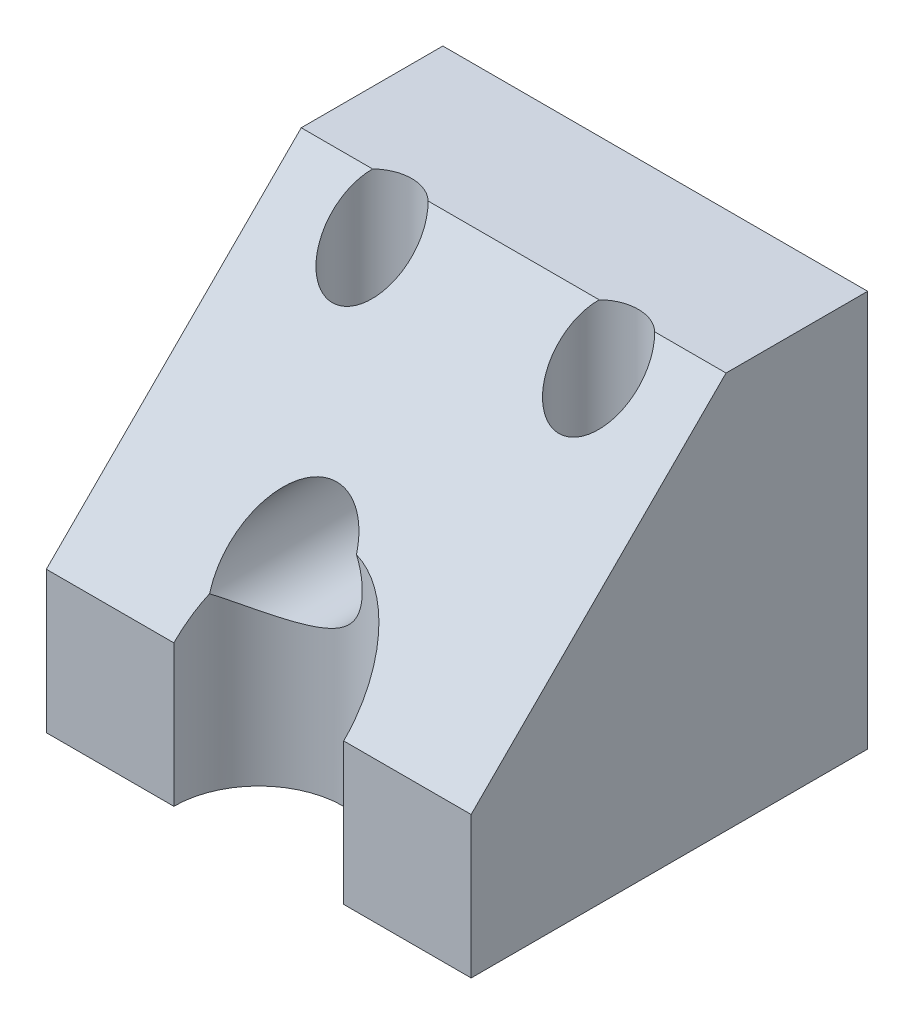
ISO-10303-21;
HEADER;
FILE_DESCRIPTION(('STEP AP214'),'2;1');
FILE_NAME('part.step','',(''),(''),'','','');
FILE_SCHEMA(('AUTOMOTIVE_DESIGN { 1 0 10303 214 1 1 1 1 }'));
ENDSEC;
DATA;
#1=APPLICATION_CONTEXT('core data for automotive mechanical design processes');
#2=APPLICATION_PROTOCOL_DEFINITION('international standard','automotive_design',2000,#1);
#3=PRODUCT_CONTEXT('',#1,'mechanical');
#4=PRODUCT('Part','Part','',(#3));
#5=PRODUCT_RELATED_PRODUCT_CATEGORY('part','',(#4));
#6=PRODUCT_DEFINITION_FORMATION('','',#4);
#7=PRODUCT_DEFINITION_CONTEXT('part definition',#1,'design');
#8=PRODUCT_DEFINITION('design','',#6,#7);
#9=PRODUCT_DEFINITION_SHAPE('','',#8);
#10=(LENGTH_UNIT() NAMED_UNIT(*) SI_UNIT(.MILLI.,.METRE.));
#11=(NAMED_UNIT(*) PLANE_ANGLE_UNIT() SI_UNIT($,.RADIAN.));
#12=(NAMED_UNIT(*) SI_UNIT($,.STERADIAN.) SOLID_ANGLE_UNIT());
#13=UNCERTAINTY_MEASURE_WITH_UNIT(LENGTH_MEASURE(1.E-05),#10,'distance_accuracy_value','');
#14=(GEOMETRIC_REPRESENTATION_CONTEXT(3) GLOBAL_UNCERTAINTY_ASSIGNED_CONTEXT((#13)) GLOBAL_UNIT_ASSIGNED_CONTEXT((#10,
#11,#12)) REPRESENTATION_CONTEXT('',''));
#15=CARTESIAN_POINT('',(0.,0.,0.));
#16=DIRECTION('',(0.,0.,1.));
#17=DIRECTION('',(1.,0.,0.));
#18=AXIS2_PLACEMENT_3D('',#15,#16,#17);
#19=CARTESIAN_POINT('',(15.,5.,14.));
#20=DIRECTION('',(0.,0.,-1.));
#21=DIRECTION('',(-1.,0.,0.));
#22=AXIS2_PLACEMENT_3D('',#19,#20,#21);
#23=PLANE('',#22);
#24=DIRECTION('',(-1.,0.,0.));
#25=VECTOR('',#24,1.);
#26=CARTESIAN_POINT('',(15.,5.,14.));
#27=LINE('',#26,#25);
#28=CARTESIAN_POINT('',(15.,5.,14.));
#29=VERTEX_POINT('',#28);
#30=CARTESIAN_POINT('',(10.5,5.,14.));
#31=VERTEX_POINT('',#30);
#32=EDGE_CURVE('E169',#29,#31,#27,.T.);
#33=ORIENTED_EDGE('',*,*,#32,.T.);
#34=DIRECTION('',(0.,-1.,0.));
#35=VECTOR('',#34,1.);
#36=CARTESIAN_POINT('',(10.5,14.,14.));
#37=LINE('',#36,#35);
#38=CARTESIAN_POINT('',(10.5,0.,14.));
#39=VERTEX_POINT('',#38);
#40=EDGE_CURVE('E217',#31,#39,#37,.T.);
#41=ORIENTED_EDGE('',*,*,#40,.T.);
#42=DIRECTION('',(-1.,0.,0.));
#43=VECTOR('',#42,1.);
#44=CARTESIAN_POINT('',(15.,0.,14.));
#45=LINE('',#44,#43);
#46=CARTESIAN_POINT('',(15.,0.,14.));
#47=VERTEX_POINT('',#46);
#48=EDGE_CURVE('E184',#47,#39,#45,.T.);
#49=ORIENTED_EDGE('',*,*,#48,.F.);
#50=DIRECTION('',(0.,-1.,0.));
#51=VECTOR('',#50,1.);
#52=CARTESIAN_POINT('',(15.,5.,14.));
#53=LINE('',#52,#51);
#54=EDGE_CURVE('E147',#29,#47,#53,.T.);
#55=ORIENTED_EDGE('',*,*,#54,.F.);
#56=EDGE_LOOP('',(#33,#41,#49,#55));
#57=FACE_BOUND('',#56,.T.);
#58=ADVANCED_FACE('F35',(#57),#23,.F.);
#59=CARTESIAN_POINT('',(4.5,0.,14.));
#60=VERTEX_POINT('',#59);
#61=CARTESIAN_POINT('',(0.,0.,14.));
#62=VERTEX_POINT('',#61);
#63=EDGE_CURVE('E183',#60,#62,#45,.T.);
#64=ORIENTED_EDGE('',*,*,#63,.F.);
#65=DIRECTION('',(0.,-1.,0.));
#66=VECTOR('',#65,1.);
#67=CARTESIAN_POINT('',(4.5,14.,14.));
#68=LINE('',#67,#66);
#69=CARTESIAN_POINT('',(4.5,5.,14.));
#70=VERTEX_POINT('',#69);
#71=EDGE_CURVE('E126',#60,#70,#68,.F.);
#72=ORIENTED_EDGE('',*,*,#71,.T.);
#73=CARTESIAN_POINT('',(0.,5.,14.));
#74=VERTEX_POINT('',#73);
#75=EDGE_CURVE('E125',#70,#74,#27,.T.);
#76=ORIENTED_EDGE('',*,*,#75,.T.);
#77=DIRECTION('',(0.,-1.,0.));
#78=VECTOR('',#77,1.);
#79=CARTESIAN_POINT('',(0.,5.,14.));
#80=LINE('',#79,#78);
#81=EDGE_CURVE('E146',#74,#62,#80,.T.);
#82=ORIENTED_EDGE('',*,*,#81,.T.);
#83=EDGE_LOOP('',(#64,#72,#76,#82));
#84=FACE_BOUND('',#83,.T.);
#85=ADVANCED_FACE('F37',(#84),#23,.F.);
#86=CARTESIAN_POINT('',(15.,0.,14.));
#87=DIRECTION('',(0.,1.,0.));
#88=DIRECTION('',(0.,0.,1.));
#89=AXIS2_PLACEMENT_3D('',#86,#87,#88);
#90=PLANE('',#89);
#91=CARTESIAN_POINT('',(3.5,0.,6.));
#92=DIRECTION('',(0.,1.,0.));
#93=DIRECTION('',(0.,0.,1.));
#94=AXIS2_PLACEMENT_3D('',#91,#92,#93);
#95=CIRCLE('',#94,1.4);
#96=CARTESIAN_POINT('',(3.5,0.,7.4));
#97=VERTEX_POINT('',#96);
#98=EDGE_CURVE('E131',#97,#97,#95,.T.);
#99=ORIENTED_EDGE('',*,*,#98,.T.);
#100=EDGE_LOOP('',(#99));
#101=FACE_BOUND('',#100,.T.);
#102=CARTESIAN_POINT('',(11.5,0.,6.));
#103=DIRECTION('',(0.,1.,0.));
#104=DIRECTION('',(0.,0.,1.));
#105=AXIS2_PLACEMENT_3D('',#102,#103,#104);
#106=CIRCLE('',#105,1.4);
#107=CARTESIAN_POINT('',(11.5,0.,7.4));
#108=VERTEX_POINT('',#107);
#109=EDGE_CURVE('E143',#108,#108,#106,.T.);
#110=ORIENTED_EDGE('',*,*,#109,.T.);
#111=EDGE_LOOP('',(#110));
#112=FACE_BOUND('',#111,.T.);
#113=ORIENTED_EDGE('',*,*,#48,.T.);
#114=CARTESIAN_POINT('',(7.5,0.,14.));
#115=DIRECTION('',(0.,1.,0.));
#116=DIRECTION('',(0.,0.,1.));
#117=AXIS2_PLACEMENT_3D('',#114,#115,#116);
#118=CIRCLE('',#117,3.);
#119=EDGE_CURVE('E221',#39,#60,#118,.T.);
#120=ORIENTED_EDGE('',*,*,#119,.T.);
#121=ORIENTED_EDGE('',*,*,#63,.T.);
#122=DIRECTION('',(0.,0.,-1.));
#123=VECTOR('',#122,1.);
#124=CARTESIAN_POINT('',(0.,0.,14.));
#125=LINE('',#124,#123);
#126=CARTESIAN_POINT('',(0.,0.,0.));
#127=VERTEX_POINT('',#126);
#128=EDGE_CURVE('E161',#62,#127,#125,.T.);
#129=ORIENTED_EDGE('',*,*,#128,.T.);
#130=DIRECTION('',(-1.,0.,0.));
#131=VECTOR('',#130,1.);
#132=CARTESIAN_POINT('',(15.,0.,0.));
#133=LINE('',#132,#131);
#134=CARTESIAN_POINT('',(15.,0.,0.));
#135=VERTEX_POINT('',#134);
#136=EDGE_CURVE('E180',#135,#127,#133,.T.);
#137=ORIENTED_EDGE('',*,*,#136,.F.);
#138=DIRECTION('',(0.,0.,-1.));
#139=VECTOR('',#138,1.);
#140=CARTESIAN_POINT('',(15.,0.,14.));
#141=LINE('',#140,#139);
#142=EDGE_CURVE('E150',#47,#135,#141,.T.);
#143=ORIENTED_EDGE('',*,*,#142,.F.);
#144=EDGE_LOOP('',(#113,#120,#121,#129,#137,#143));
#145=FACE_BOUND('',#144,.T.);
#146=ADVANCED_FACE('F211',(#101,#112,#145),#90,.F.);
#147=CARTESIAN_POINT('',(15.,0.,0.));
#148=DIRECTION('',(0.,0.,1.));
#149=DIRECTION('',(1.,0.,0.));
#150=AXIS2_PLACEMENT_3D('',#147,#148,#149);
#151=PLANE('',#150);
#152=CARTESIAN_POINT('',(6.35,7.,0.));
#153=DIRECTION('',(0.,0.,-1.));
#154=DIRECTION('',(-1.,0.,0.));
#155=AXIS2_PLACEMENT_3D('',#152,#153,#154);
#156=CIRCLE('',#155,1.9);
#157=CARTESIAN_POINT('',(4.45,7.,0.));
#158=VERTEX_POINT('',#157);
#159=EDGE_CURVE('E134',#158,#158,#156,.T.);
#160=ORIENTED_EDGE('',*,*,#159,.F.);
#161=EDGE_LOOP('',(#160));
#162=FACE_BOUND('',#161,.T.);
#163=DIRECTION('',(0.,1.,0.));
#164=VECTOR('',#163,1.);
#165=CARTESIAN_POINT('',(0.,0.,0.));
#166=LINE('',#165,#164);
#167=CARTESIAN_POINT('',(0.,14.,0.));
#168=VERTEX_POINT('',#167);
#169=EDGE_CURVE('E163',#127,#168,#166,.T.);
#170=ORIENTED_EDGE('',*,*,#169,.T.);
#171=DIRECTION('',(-1.,0.,0.));
#172=VECTOR('',#171,1.);
#173=CARTESIAN_POINT('',(15.,14.,0.));
#174=LINE('',#173,#172);
#175=CARTESIAN_POINT('',(15.,14.,0.));
#176=VERTEX_POINT('',#175);
#177=EDGE_CURVE('E176',#176,#168,#174,.T.);
#178=ORIENTED_EDGE('',*,*,#177,.F.);
#179=DIRECTION('',(0.,1.,0.));
#180=VECTOR('',#179,1.);
#181=CARTESIAN_POINT('',(15.,0.,0.));
#182=LINE('',#181,#180);
#183=EDGE_CURVE('E153',#135,#176,#182,.T.);
#184=ORIENTED_EDGE('',*,*,#183,.F.);
#185=ORIENTED_EDGE('',*,*,#136,.T.);
#186=EDGE_LOOP('',(#170,#178,#184,#185));
#187=FACE_BOUND('',#186,.T.);
#188=ADVANCED_FACE('F229',(#162,#187),#151,.F.);
#189=CARTESIAN_POINT('',(15.,14.,0.));
#190=DIRECTION('',(0.,-1.,0.));
#191=DIRECTION('',(0.,0.,-1.));
#192=AXIS2_PLACEMENT_3D('',#189,#190,#191);
#193=PLANE('',#192);
#194=DIRECTION('',(-1.,0.,0.));
#195=VECTOR('',#194,1.);
#196=CARTESIAN_POINT('',(15.,14.,5.00000000000004));
#197=LINE('',#196,#195);
#198=CARTESIAN_POINT('',(2.52020410288669,14.,5.00000000000004));
#199=VERTEX_POINT('',#198);
#200=CARTESIAN_POINT('',(0.,14.,5.00000000000004));
#201=VERTEX_POINT('',#200);
#202=EDGE_CURVE('E172',#199,#201,#197,.T.);
#203=ORIENTED_EDGE('',*,*,#202,.F.);
#204=CARTESIAN_POINT('',(3.5,14.,6.));
#205=DIRECTION('',(0.,-1.,0.));
#206=DIRECTION('',(0.,0.,-1.));
#207=AXIS2_PLACEMENT_3D('',#204,#205,#206);
#208=CIRCLE('',#207,1.4);
#209=CARTESIAN_POINT('',(4.47979589711331,14.,5.00000000000004));
#210=VERTEX_POINT('',#209);
#211=EDGE_CURVE('E61',#199,#210,#208,.T.);
#212=ORIENTED_EDGE('',*,*,#211,.T.);
#213=CARTESIAN_POINT('',(10.5202041028867,14.,5.00000000000004));
#214=VERTEX_POINT('',#213);
#215=EDGE_CURVE('E177',#214,#210,#197,.T.);
#216=ORIENTED_EDGE('',*,*,#215,.F.);
#217=CARTESIAN_POINT('',(11.5,14.,6.));
#218=DIRECTION('',(0.,-1.,0.));
#219=DIRECTION('',(0.,0.,-1.));
#220=AXIS2_PLACEMENT_3D('',#217,#218,#219);
#221=CIRCLE('',#220,1.4);
#222=CARTESIAN_POINT('',(12.4797958971133,14.,5.00000000000004));
#223=VERTEX_POINT('',#222);
#224=EDGE_CURVE('E140',#214,#223,#221,.T.);
#225=ORIENTED_EDGE('',*,*,#224,.T.);
#226=CARTESIAN_POINT('',(15.,14.,5.00000000000004));
#227=VERTEX_POINT('',#226);
#228=EDGE_CURVE('E173',#227,#223,#197,.T.);
#229=ORIENTED_EDGE('',*,*,#228,.F.);
#230=DIRECTION('',(0.,0.,1.));
#231=VECTOR('',#230,1.);
#232=CARTESIAN_POINT('',(15.,14.,0.));
#233=LINE('',#232,#231);
#234=EDGE_CURVE('E155',#176,#227,#233,.T.);
#235=ORIENTED_EDGE('',*,*,#234,.F.);
#236=ORIENTED_EDGE('',*,*,#177,.T.);
#237=DIRECTION('',(0.,0.,1.));
#238=VECTOR('',#237,1.);
#239=CARTESIAN_POINT('',(0.,14.,0.));
#240=LINE('',#239,#238);
#241=EDGE_CURVE('E165',#168,#201,#240,.T.);
#242=ORIENTED_EDGE('',*,*,#241,.T.);
#243=EDGE_LOOP('',(#203,#212,#216,#225,#229,#235,#236,#242));
#244=FACE_BOUND('',#243,.T.);
#245=ADVANCED_FACE('F232',(#244),#193,.F.);
#246=CARTESIAN_POINT('',(15.,14.,5.00000000000004));
#247=DIRECTION('',(0.,-0.707106781186546,-0.707106781186549));
#248=DIRECTION('',(0.,0.707106781186549,-0.707106781186546));
#249=AXIS2_PLACEMENT_3D('',#246,#247,#248);
#250=PLANE('',#249);
#251=ORIENTED_EDGE('',*,*,#75,.F.);
#252=CARTESIAN_POINT('',(7.5,5.,14.));
#253=DIRECTION('',(0.,-0.707106781186546,-0.707106781186549));
#254=DIRECTION('',(0.,-0.707106781186549,0.707106781186546));
#255=AXIS2_PLACEMENT_3D('',#252,#253,#254);
#256=ELLIPSE('',#255,4.24264068711929,3.);
#257=CARTESIAN_POINT('',(4.69563469152131,6.06561494762474,12.9343850523753));
#258=VERTEX_POINT('',#257);
#259=EDGE_CURVE('E115',#70,#258,#256,.T.);
#260=ORIENTED_EDGE('',*,*,#259,.T.);
#261=CARTESIAN_POINT('',(6.35,7.,12.));
#262=DIRECTION('',(0.,-0.707106781186546,-0.707106781186549));
#263=DIRECTION('',(0.,0.707106781186549,-0.707106781186546));
#264=AXIS2_PLACEMENT_3D('',#261,#262,#263);
#265=ELLIPSE('',#264,2.68700576850887,1.9);
#266=CARTESIAN_POINT('',(7.98978099659515,7.95974907304223,11.0402509269578));
#267=VERTEX_POINT('',#266);
#268=EDGE_CURVE('E123',#258,#267,#265,.T.);
#269=ORIENTED_EDGE('',*,*,#268,.T.);
#270=EDGE_CURVE('E55',#267,#31,#256,.T.);
#271=ORIENTED_EDGE('',*,*,#270,.T.);
#272=ORIENTED_EDGE('',*,*,#32,.F.);
#273=DIRECTION('',(0.,-0.707106781186549,0.707106781186546));
#274=VECTOR('',#273,1.);
#275=CARTESIAN_POINT('',(15.,14.,5.00000000000004));
#276=LINE('',#275,#274);
#277=EDGE_CURVE('E157',#227,#29,#276,.T.);
#278=ORIENTED_EDGE('',*,*,#277,.F.);
#279=ORIENTED_EDGE('',*,*,#228,.T.);
#280=CARTESIAN_POINT('',(11.5,13.,6.));
#281=DIRECTION('',(0.,-0.707106781186546,-0.707106781186549));
#282=DIRECTION('',(0.,-0.707106781186549,0.707106781186546));
#283=AXIS2_PLACEMENT_3D('',#280,#281,#282);
#284=ELLIPSE('',#283,1.97989898732234,1.4);
#285=EDGE_CURVE('E187',#223,#214,#284,.T.);
#286=ORIENTED_EDGE('',*,*,#285,.T.);
#287=ORIENTED_EDGE('',*,*,#215,.T.);
#288=CARTESIAN_POINT('',(3.5,13.,6.));
#289=DIRECTION('',(0.,-0.707106781186546,-0.707106781186549));
#290=DIRECTION('',(0.,-0.707106781186549,0.707106781186546));
#291=AXIS2_PLACEMENT_3D('',#288,#289,#290);
#292=ELLIPSE('',#291,1.97989898732234,1.4);
#293=EDGE_CURVE('E48',#210,#199,#292,.T.);
#294=ORIENTED_EDGE('',*,*,#293,.T.);
#295=ORIENTED_EDGE('',*,*,#202,.T.);
#296=DIRECTION('',(0.,-0.707106781186549,0.707106781186546));
#297=VECTOR('',#296,1.);
#298=CARTESIAN_POINT('',(0.,14.,5.00000000000004));
#299=LINE('',#298,#297);
#300=EDGE_CURVE('E151',#201,#74,#299,.T.);
#301=ORIENTED_EDGE('',*,*,#300,.T.);
#302=EDGE_LOOP('',(#251,#260,#269,#271,#272,#278,#279,#286,#287,#294,#295,#301));
#303=FACE_BOUND('',#302,.T.);
#304=ADVANCED_FACE('F122',(#303),#250,.F.);
#305=CARTESIAN_POINT('',(15.,0.,0.));
#306=DIRECTION('',(1.,0.,0.));
#307=DIRECTION('',(0.,0.,-1.));
#308=AXIS2_PLACEMENT_3D('',#305,#306,#307);
#309=PLANE('',#308);
#310=ORIENTED_EDGE('',*,*,#54,.T.);
#311=ORIENTED_EDGE('',*,*,#142,.T.);
#312=ORIENTED_EDGE('',*,*,#183,.T.);
#313=ORIENTED_EDGE('',*,*,#234,.T.);
#314=ORIENTED_EDGE('',*,*,#277,.T.);
#315=EDGE_LOOP('',(#310,#311,#312,#313,#314));
#316=FACE_BOUND('',#315,.T.);
#317=ADVANCED_FACE('F259',(#316),#309,.T.);
#318=CARTESIAN_POINT('',(0.,0.,0.));
#319=DIRECTION('',(1.,0.,0.));
#320=DIRECTION('',(0.,0.,-1.));
#321=AXIS2_PLACEMENT_3D('',#318,#319,#320);
#322=PLANE('',#321);
#323=ORIENTED_EDGE('',*,*,#81,.F.);
#324=ORIENTED_EDGE('',*,*,#300,.F.);
#325=ORIENTED_EDGE('',*,*,#241,.F.);
#326=ORIENTED_EDGE('',*,*,#169,.F.);
#327=ORIENTED_EDGE('',*,*,#128,.F.);
#328=EDGE_LOOP('',(#323,#324,#325,#326,#327));
#329=FACE_BOUND('',#328,.T.);
#330=ADVANCED_FACE('F247',(#329),#322,.F.);
#331=CARTESIAN_POINT('',(11.5,14.,6.));
#332=DIRECTION('',(0.,-1.,0.));
#333=DIRECTION('',(0.,0.,-1.));
#334=AXIS2_PLACEMENT_3D('',#331,#332,#333);
#335=CYLINDRICAL_SURFACE('',#334,1.4);
#336=ORIENTED_EDGE('',*,*,#224,.F.);
#337=ORIENTED_EDGE('',*,*,#285,.F.);
#338=EDGE_LOOP('',(#336,#337));
#339=FACE_BOUND('',#338,.T.);
#340=ORIENTED_EDGE('',*,*,#109,.F.);
#341=EDGE_LOOP('',(#340));
#342=FACE_BOUND('',#341,.T.);
#343=ADVANCED_FACE('F251',(#339,#342),#335,.F.);
#344=CARTESIAN_POINT('',(3.5,14.,6.));
#345=DIRECTION('',(0.,-1.,0.));
#346=DIRECTION('',(0.,0.,-1.));
#347=AXIS2_PLACEMENT_3D('',#344,#345,#346);
#348=CYLINDRICAL_SURFACE('',#347,1.4);
#349=CARTESIAN_POINT('',(4.45,7.,7.02834819006016));
#350=CARTESIAN_POINT('',(4.45000064995976,6.92609286150742,7.0283480283778));
#351=CARTESIAN_POINT('',(4.45433351958509,6.85218305321146,7.02439538414719));
#352=CARTESIAN_POINT('',(4.47141138318347,6.70623064714899,7.00821539252774));
#353=CARTESIAN_POINT('',(4.48415767027153,6.63418833818028,6.99598677314103));
#354=CARTESIAN_POINT('',(4.51727194159195,6.49370090207656,6.96214487221569));
#355=CARTESIAN_POINT('',(4.537679830412,6.42527678659842,6.94048235909895));
#356=CARTESIAN_POINT('',(4.58428473873445,6.29501131971183,6.88633629637029));
#357=CARTESIAN_POINT('',(4.61047167480387,6.23315877715606,6.85387154529549));
#358=CARTESIAN_POINT('',(4.65892439084027,6.13246793942749,6.78624271031036));
#359=CARTESIAN_POINT('',(4.68062625464207,6.09166633371794,6.753589300313));
#360=CARTESIAN_POINT('',(4.72374189031642,6.01655918487933,6.68133712244338));
#361=CARTESIAN_POINT('',(4.74515582422065,5.98224983281024,6.64174245337276));
#362=CARTESIAN_POINT('',(4.78575063416761,5.92088436065188,6.55596890607038));
#363=CARTESIAN_POINT('',(4.80492188218498,5.89385890745924,6.50976340596175));
#364=CARTESIAN_POINT('',(4.83897781561658,5.84776757546238,6.41207952433485));
#365=CARTESIAN_POINT('',(4.85386258655594,5.82870153784605,6.36060124804841));
#366=CARTESIAN_POINT('',(4.87691819989038,5.79985602826036,6.25815008476682));
#367=CARTESIAN_POINT('',(4.88551617276316,5.78947681683498,6.20744083801468));
#368=CARTESIAN_POINT('',(4.89705780956946,5.77564630089286,6.10445984095688));
#369=CARTESIAN_POINT('',(4.90000241222446,5.77219384620916,6.05218835152004));
#370=CARTESIAN_POINT('',(4.89999764298233,5.77220024740515,5.94894543502815));
#371=CARTESIAN_POINT('',(4.89719223228371,5.77549029325675,5.8979738261617));
#372=CARTESIAN_POINT('',(4.8861972682631,5.7886560168048,5.7974890029382));
#373=CARTESIAN_POINT('',(4.87800845038451,5.79853079494386,5.74797559033778));
#374=CARTESIAN_POINT('',(4.85690691534817,5.82485962098794,5.6518261568488));
#375=CARTESIAN_POINT('',(4.84399726756242,5.84130939463136,5.60518828932144));
#376=CARTESIAN_POINT('',(4.81451334901581,5.88067780229595,5.51599358309867));
#377=CARTESIAN_POINT('',(4.79793931468207,5.90359601899793,5.47343648136509));
#378=CARTESIAN_POINT('',(4.76216717351014,5.95606080501808,5.39260783230651));
#379=CARTESIAN_POINT('',(4.74292635641893,5.98572168777648,5.35442965956175));
#380=CARTESIAN_POINT('',(4.70364748042908,6.05080735248944,5.28385213463434));
#381=CARTESIAN_POINT('',(4.68360921738074,6.08623361767234,5.25145427402904));
#382=CARTESIAN_POINT('',(4.64284034045792,6.16471918227356,5.19045738392367));
#383=CARTESIAN_POINT('',(4.62216216658762,6.20814254488874,5.16229366403411));
#384=CARTESIAN_POINT('',(4.5831466174929,6.29949915013994,5.1124199320163));
#385=CARTESIAN_POINT('',(4.56481048836009,6.3474347701721,5.0907133473309));
#386=CARTESIAN_POINT('',(4.5292834560693,6.45361003394533,5.05058176042498));
#387=CARTESIAN_POINT('',(4.5126089833088,6.51235432547135,5.03303672442054));
#388=CARTESIAN_POINT('',(4.48481091737809,6.63271841425338,5.00474164197536));
#389=CARTESIAN_POINT('',(4.47369068622309,6.69433992849533,4.99399571002527));
#390=CARTESIAN_POINT('',(4.45637329250652,6.82851242938649,4.97749313470097));
#391=CARTESIAN_POINT('',(4.45116582982534,6.90131540556864,4.97272769669764));
#392=CARTESIAN_POINT('',(4.44918329486831,7.04717499932989,4.9708985047513));
#393=CARTESIAN_POINT('',(4.4524151188537,7.12023177559501,4.97384104948217));
#394=CARTESIAN_POINT('',(4.46766523650853,7.26993930607977,4.98819606250099));
#395=CARTESIAN_POINT('',(4.48029479734975,7.34647391013808,5.00019865844252));
#396=CARTESIAN_POINT('',(4.51409460865593,7.49522091266385,5.03449960939569));
#397=CARTESIAN_POINT('',(4.53525502935904,7.56743817622509,5.05678611893197));
#398=CARTESIAN_POINT('',(4.57875750787282,7.68991298817058,5.10717970427288));
#399=CARTESIAN_POINT('',(4.59986477443471,7.74155133010828,5.13300127113054));
#400=CARTESIAN_POINT('',(4.64437760291101,7.83887243109401,5.19267015736367));
#401=CARTESIAN_POINT('',(4.66778138882748,7.88455972968328,5.22651130306869));
#402=CARTESIAN_POINT('',(4.71481471806554,7.96877013279968,5.30269442762766));
#403=CARTESIAN_POINT('',(4.73844473641724,8.00724439022692,5.34509059513542));
#404=CARTESIAN_POINT('',(4.78310888494862,8.07541703446047,5.43763074131631));
#405=CARTESIAN_POINT('',(4.80414415960836,8.1051192985038,5.48777128199222));
#406=CARTESIAN_POINT('',(4.83893379504213,8.15214439802476,5.5880094536838));
#407=CARTESIAN_POINT('',(4.85325208368114,8.17050906185026,5.63742566774936));
#408=CARTESIAN_POINT('',(4.8765702906528,8.19973246107825,5.73962184090564));
#409=CARTESIAN_POINT('',(4.88557141507345,8.21059289875313,5.79240103416308));
#410=CARTESIAN_POINT('',(4.89710542657529,8.22440729016771,5.89660316160271));
#411=CARTESIAN_POINT('',(4.89997363173768,8.2277715713313,5.94793542240388));
#412=CARTESIAN_POINT('',(4.90002598684731,8.22783381015203,6.05060293457127));
#413=CARTESIAN_POINT('',(4.89721102209464,8.22453280609903,6.10193818422624));
#414=CARTESIAN_POINT('',(4.8861688716616,8.21130938682654,6.20268708386456));
#415=CARTESIAN_POINT('',(4.877989262579,8.20144516675573,6.25211361826634));
#416=CARTESIAN_POINT('',(4.85691721945477,8.17515333508244,6.34812511303982));
#417=CARTESIAN_POINT('',(4.84402535542817,8.15872651729824,6.39471041630433));
#418=CARTESIAN_POINT('',(4.81448988603437,8.11929245558608,6.48409377787564));
#419=CARTESIAN_POINT('',(4.79782330009758,8.09624466214885,6.52686630262102));
#420=CARTESIAN_POINT('',(4.76217529782355,8.04394018837511,6.6073326125224));
#421=CARTESIAN_POINT('',(4.74319369399646,8.01468300500716,6.64502598580446));
#422=CARTESIAN_POINT('',(4.7036666095967,7.94926302770685,6.71617841882637));
#423=CARTESIAN_POINT('',(4.68308894437246,7.91287080594051,6.74940777295595));
#424=CARTESIAN_POINT('',(4.64270481649698,7.83490843057553,6.8096571375727));
#425=CARTESIAN_POINT('',(4.62289864668738,7.79333633547955,6.83667480896361));
#426=CARTESIAN_POINT('',(4.58339420878996,7.70133269522837,6.88735632382095));
#427=CARTESIAN_POINT('',(4.56393614989085,7.65042917192698,6.91034798559363));
#428=CARTESIAN_POINT('',(4.52894608409965,7.54485382248806,6.94971759276988));
#429=CARTESIAN_POINT('',(4.51341718615816,7.49017905561006,6.96609030701237));
#430=CARTESIAN_POINT('',(4.4839087395384,7.3644564246167,6.99623341025771));
#431=CARTESIAN_POINT('',(4.47125829739749,7.2926989222263,7.00836328434396));
#432=CARTESIAN_POINT('',(4.45430075256531,7.14729600066153,7.02442355678725));
#433=CARTESIAN_POINT('',(4.44999935230751,7.07364932593554,7.02834835117851));
#434=CARTESIAN_POINT('',(4.45,7.,7.02834819006016));
#435=B_SPLINE_CURVE_WITH_KNOTS('',3,(#349,#350,#351,#352,#353,#354,#355,#356,#357,#358,#359,
#360,#361,#362,#363,#364,#365,#366,#367,#368,#369,#370,#371,#372,#373,#374,#375,#376,#377,#378,
#379,#380,#381,#382,#383,#384,#385,#386,#387,#388,#389,#390,#391,#392,#393,#394,#395,#396,#397,
#398,#399,#400,#401,#402,#403,#404,#405,#406,#407,#408,#409,#410,#411,#412,#413,#414,#415,#416,
#417,#418,#419,#420,#421,#422,#423,#424,#425,#426,#427,#428,#429,#430,#431,#432,#433,#434),
.UNSPECIFIED.,.T.,.F.,(4,2,2,2,2,2,2,2,2,2,2,2,2,2,2,2,2,2,2,2,2,2,2,2,2,2,2,2,2,2,2,2,2,2,2,2,
2,2,2,2,2,2,4),(0.,0.221490034531486,0.443014119292837,0.665708365242151,0.888017078108974,
1.05705852724063,1.22600049185861,1.3956430073618,1.56528213787072,1.72191999076116,
1.87853183225765,2.03127055265376,2.18398841129008,2.33660715241643,2.48921604941571,
2.64463587706335,2.80009575210956,2.96663534122785,3.13326317235149,3.32313147959731,
3.51311457638937,3.7316189275394,3.95030188792532,4.18460902882451,4.41864695530529,
4.60230759620949,4.78582730728731,4.97054816295571,5.15518724905327,5.31822255883963,
5.48122087324598,5.63505173198879,5.78885862946204,5.94131959988107,6.09376213405211,
6.24715895296733,6.40056820352223,6.5601143249891,6.71972042774178,6.89647412029288,
7.07336723498918,7.29393404378885,7.51465144778253),.UNSPECIFIED.);
#436=CARTESIAN_POINT('',(4.45,7.,7.02834819006016));
#437=VERTEX_POINT('',#436);
#438=EDGE_CURVE('E129',#437,#437,#435,.T.);
#439=ORIENTED_EDGE('',*,*,#438,.T.);
#440=EDGE_LOOP('',(#439));
#441=FACE_BOUND('',#440,.T.);
#442=ORIENTED_EDGE('',*,*,#211,.F.);
#443=ORIENTED_EDGE('',*,*,#293,.F.);
#444=EDGE_LOOP('',(#442,#443));
#445=FACE_BOUND('',#444,.T.);
#446=ORIENTED_EDGE('',*,*,#98,.F.);
#447=EDGE_LOOP('',(#446));
#448=FACE_BOUND('',#447,.T.);
#449=ADVANCED_FACE('F193',(#441,#445,#448),#348,.F.);
#450=CARTESIAN_POINT('',(6.35,7.,14.));
#451=DIRECTION('',(0.,0.,-1.));
#452=DIRECTION('',(-1.,0.,0.));
#453=AXIS2_PLACEMENT_3D('',#450,#451,#452);
#454=CYLINDRICAL_SURFACE('',#453,1.9);
#455=ORIENTED_EDGE('',*,*,#438,.F.);
#456=EDGE_LOOP('',(#455));
#457=FACE_BOUND('',#456,.T.);
#458=ORIENTED_EDGE('',*,*,#159,.T.);
#459=EDGE_LOOP('',(#458));
#460=FACE_BOUND('',#459,.T.);
#461=ORIENTED_EDGE('',*,*,#268,.F.);
#462=CARTESIAN_POINT('',(4.50004592701822,6.56679112675511,13.9834));
#463=CARTESIAN_POINT('',(4.50032739318488,6.56571448715011,13.9301235412732));
#464=CARTESIAN_POINT('',(4.50204695274997,6.55817289952806,13.8777570163658));
#465=CARTESIAN_POINT('',(4.50794337550782,6.53417729167799,13.7761418180256));
#466=CARTESIAN_POINT('',(4.51207521169928,6.51788700782004,13.7268538738476));
#467=CARTESIAN_POINT('',(4.52423813732502,6.47343263303276,13.6137862387994));
#468=CARTESIAN_POINT('',(4.53313058930759,6.44310708453319,13.5510283500572));
#469=CARTESIAN_POINT('',(4.5543173795353,6.37813597667564,13.4283206807857));
#470=CARTESIAN_POINT('',(4.56661927559913,6.34348091479269,13.3683774889703));
#471=CARTESIAN_POINT('',(4.59477816788162,6.27149470248636,13.2493339842895));
#472=CARTESIAN_POINT('',(4.61069982744601,6.23412453873679,13.1902729182248));
#473=CARTESIAN_POINT('',(4.64592359822312,6.15865495430322,13.0737473759073));
#474=CARTESIAN_POINT('',(4.66522229439552,6.12055630464561,13.0162813540397));
#475=CARTESIAN_POINT('',(4.718265265554,6.02437995000515,12.8728419136865));
#476=CARTESIAN_POINT('',(4.75428115172063,5.96629044306482,12.7877034444881));
#477=CARTESIAN_POINT('',(4.83456397589973,5.85180319380198,12.6201154391962));
#478=CARTESIAN_POINT('',(4.87883671150522,5.79540667272152,12.5376678406033));
#479=CARTESIAN_POINT('',(4.97556391130926,5.68614846336567,12.3764274848186));
#480=CARTESIAN_POINT('',(5.02794978342751,5.63326201563209,12.2976106855737));
#481=CARTESIAN_POINT('',(5.14144506101817,5.53194741904198,12.1435617208288));
#482=CARTESIAN_POINT('',(5.20254743318626,5.48351572699012,12.068326729838));
#483=CARTESIAN_POINT('',(5.34755989560015,5.38307685249172,11.9068904313503));
#484=CARTESIAN_POINT('',(5.43356730526926,5.33244086055151,11.8216870957693));
#485=CARTESIAN_POINT('',(5.61896026984228,5.24325853523181,11.6597443816394));
#486=CARTESIAN_POINT('',(5.71833907451655,5.20470613422532,11.5830007677367));
#487=CARTESIAN_POINT('',(5.91063495921706,5.14929745454983,11.4534622272984));
#488=CARTESIAN_POINT('',(6.00154140162612,5.12979743453899,11.3988374022129));
#489=CARTESIAN_POINT('',(6.19019276816524,5.104347300787,11.2989325890626));
#490=CARTESIAN_POINT('',(6.28793316539981,5.0983883033339,11.2536464919845));
#491=CARTESIAN_POINT('',(6.48831758252512,5.10237674700127,11.1736575964102));
#492=CARTESIAN_POINT('',(6.59099351322282,5.1124467760454,11.1390388016068));
#493=CARTESIAN_POINT('',(6.79642513798329,5.1502472921954,11.0817241022098));
#494=CARTESIAN_POINT('',(6.89918074340303,5.17796684976267,11.0590208347415));
#495=CARTESIAN_POINT('',(7.0873897876598,5.24643344180984,11.0271718434408));
#496=CARTESIAN_POINT('',(7.17338710765823,5.28508772274372,11.016673925006));
#497=CARTESIAN_POINT('',(7.33912133376049,5.37503007131691,11.0031628677665));
#498=CARTESIAN_POINT('',(7.41885770199151,5.42631922284416,11.000150371348));
#499=CARTESIAN_POINT('',(7.5700848115264,5.54040822507857,10.9998598014823));
#500=CARTESIAN_POINT('',(7.64154096677841,5.60325370730553,11.0026049263244));
#501=CARTESIAN_POINT('',(7.77416862484961,5.73875430257282,11.0118136030097));
#502=CARTESIAN_POINT('',(7.83533638004929,5.81141297283298,11.018278506033));
#503=CARTESIAN_POINT('',(7.95099066917236,5.97168510244873,11.033468368395));
#504=CARTESIAN_POINT('',(8.00441585139708,6.06005187984643,11.0423421305401));
#505=CARTESIAN_POINT('',(8.09629733066873,6.24432143511758,11.059486076875));
#506=CARTESIAN_POINT('',(8.13475052822309,6.3402257684784,11.0677561357988));
#507=CARTESIAN_POINT('',(8.19686627299622,6.5411252544402,11.08187641704));
#508=CARTESIAN_POINT('',(8.21988026459387,6.64633022148127,11.087617406261));
#509=CARTESIAN_POINT('',(8.24781741522716,6.85924668451227,11.0946628070388));
#510=CARTESIAN_POINT('',(8.25274544060799,6.96695749840965,11.095968412006));
#511=CARTESIAN_POINT('',(8.24447096279928,7.17849706116561,11.0938385253225));
#512=CARTESIAN_POINT('',(8.23178849103868,7.28234801755055,11.0905390066856));
#513=CARTESIAN_POINT('',(8.18963935764768,7.48640081569754,11.0802635469918));
#514=CARTESIAN_POINT('',(8.16016946402101,7.58660195082477,11.0732868980152));
#515=CARTESIAN_POINT('',(8.08513345399593,7.7811800210173,11.0573672625879));
#516=CARTESIAN_POINT('',(8.03948774121841,7.87552539397414,11.0484146366286));
#517=CARTESIAN_POINT('',(7.93329636929275,8.05550649788391,11.0309695955813));
#518=CARTESIAN_POINT('',(7.87274643041019,8.14113971715044,11.0224773135368));
#519=CARTESIAN_POINT('',(7.73651326513327,8.30349005578749,11.0085357468198));
#520=CARTESIAN_POINT('',(7.66048653883639,8.37992745942704,11.0031687089607));
#521=CARTESIAN_POINT('',(7.49648924735226,8.51891196504863,10.9988850887736));
#522=CARTESIAN_POINT('',(7.40852620254624,8.58146774815469,10.9999644632067));
#523=CARTESIAN_POINT('',(7.22902829837789,8.68746492349829,11.0109903114254));
#524=CARTESIAN_POINT('',(7.13799133835096,8.73180003974715,11.0204222476044));
#525=CARTESIAN_POINT('',(6.95140577927799,8.80508781032419,11.0490800990334));
#526=CARTESIAN_POINT('',(6.85585981868072,8.83404934192455,11.0683003495597));
#527=CARTESIAN_POINT('',(6.67154666502711,8.87478537658689,11.1152122260965));
#528=CARTESIAN_POINT('',(6.58283377677382,8.88772698137435,11.1421236883224));
#529=CARTESIAN_POINT('',(6.40750496644279,8.90116512856238,11.2044471191762));
#530=CARTESIAN_POINT('',(6.32088941447101,8.90165949022337,11.2398605762446));
#531=CARTESIAN_POINT('',(6.14867314817948,8.89134851229019,11.3198361584228));
#532=CARTESIAN_POINT('',(6.06323998509609,8.88010726263099,11.3646980942674));
#533=CARTESIAN_POINT('',(5.89853397603482,8.84749549622764,11.4614075736832));
#534=CARTESIAN_POINT('',(5.81926422247755,8.82611993239634,11.513258588734));
#535=CARTESIAN_POINT('',(5.6282597825646,8.76178140094738,11.6512203240568));
#536=CARTESIAN_POINT('',(5.52108968183624,8.71337308894167,11.741120928466));
#537=CARTESIAN_POINT('',(5.32357676687902,8.6029106246711,11.9306919705128));
#538=CARTESIAN_POINT('',(5.23328171768394,8.54081879062081,12.0303889569782));
#539=CARTESIAN_POINT('',(5.09353929708428,8.42717816192883,12.206245183415));
#540=CARTESIAN_POINT('',(5.03990812204197,8.37794015560561,12.2806483327792));
#541=CARTESIAN_POINT('',(4.94052133008996,8.2761012980217,12.4324212571684));
#542=CARTESIAN_POINT('',(4.89476985632833,8.22349869746948,12.5097925668696));
#543=CARTESIAN_POINT('',(4.81091617921478,8.11617732477546,12.6670461474336));
#544=CARTESIAN_POINT('',(4.77280867172947,8.06146005166449,12.7469266323577));
#545=CARTESIAN_POINT('',(4.70395885965668,7.95119303752443,12.9091657125528));
#546=CARTESIAN_POINT('',(4.67321281499481,7.89564373452611,12.9915230254002));
#547=CARTESIAN_POINT('',(4.62135564165397,7.790497160435,13.1515675803075));
#548=CARTESIAN_POINT('',(4.59962206929237,7.74081854101244,13.2289970963306));
#549=CARTESIAN_POINT('',(4.57145489047312,7.66891525894206,13.3478657304825));
#550=CARTESIAN_POINT('',(4.56279925921217,7.64536447972116,13.3879777201312));
#551=CARTESIAN_POINT('',(4.54700988246976,7.59983815511578,13.4693711287982));
#552=CARTESIAN_POINT('',(4.5398755304009,7.57786198420929,13.5106520742469));
#553=CARTESIAN_POINT('',(4.52592623657891,7.53237177448001,13.6031384073782));
#554=CARTESIAN_POINT('',(4.51945829272306,7.50942405030516,13.6546821207022));
#555=CARTESIAN_POINT('',(4.50911457387104,7.47068955718905,13.7604601251525));
#556=CARTESIAN_POINT('',(4.50521872549053,7.45484765183206,13.8146699453988));
#557=CARTESIAN_POINT('',(4.50200844321278,7.44151944231337,13.8886577325672));
#558=CARTESIAN_POINT('',(4.50136889976686,7.43882641387748,13.9074431393362));
#559=CARTESIAN_POINT('',(4.50043904398065,7.43488721385952,13.9452745607573));
#560=CARTESIAN_POINT('',(4.50015063190974,7.43364891631248,13.9643214342216));
#561=CARTESIAN_POINT('',(4.50004592701822,7.43320887324489,13.9834));
#562=B_SPLINE_CURVE_WITH_KNOTS('',3,(#462,#463,#464,#465,#466,#467,#468,#469,#470,#471,#472,
#473,#474,#475,#476,#477,#478,#479,#480,#481,#482,#483,#484,#485,#486,#487,#488,#489,#490,#491,
#492,#493,#494,#495,#496,#497,#498,#499,#500,#501,#502,#503,#504,#505,#506,#507,#508,#509,#510,
#511,#512,#513,#514,#515,#516,#517,#518,#519,#520,#521,#522,#523,#524,#525,#526,#527,#528,#529,
#530,#531,#532,#533,#534,#535,#536,#537,#538,#539,#540,#541,#542,#543,#544,#545,#546,#547,#548,
#549,#550,#551,#552,#553,#554,#555,#556,#557,#558,#559,#560,#561),.UNSPECIFIED.,.F.,.F.,(4,2,2,
2,2,2,2,2,2,2,2,2,2,2,2,2,2,2,2,2,2,2,2,2,2,2,2,2,2,2,2,2,2,2,2,2,2,2,2,2,2,2,2,2,2,2,2,2,2,4),
(0.,0.158355475300787,0.313845567454207,0.524190467002005,0.735005426256407,0.94993242125809,
1.16464331353343,1.49182231695067,1.81923192180749,2.14401102651521,2.46852953537473,
2.860929294882,3.25313169881922,3.5753581094595,3.8973730594007,4.22186259378031,
4.54615138193587,4.82939818275806,5.1126692904988,5.39708393065424,5.68160194746073,
5.99115300173694,6.30076810508366,6.62268813299935,6.9445215363545,7.25705079674138,
7.56964024712991,7.88378971729975,8.19802950064204,8.5202035461023,8.84217554278462,
9.14559437611942,9.44883781316508,9.72836323357296,10.0079376261028,10.2982790553471,
10.5887652324481,11.0303728383033,11.4732120904794,11.7851181751243,12.0971877626459,
12.409040050837,12.720733561135,13.0040417819034,13.14593591055,13.2877733547889,
13.4578771838433,13.6266372667897,13.6835458255203,13.7407610149),.UNSPECIFIED.);
#563=EDGE_CURVE('E11',#258,#267,#562,.T.);
#564=ORIENTED_EDGE('',*,*,#563,.T.);
#565=EDGE_LOOP('',(#461,#564));
#566=FACE_BOUND('',#565,.T.);
#567=ADVANCED_FACE('F128',(#457,#460,#566),#454,.F.);
#568=CARTESIAN_POINT('',(7.5,14.,14.));
#569=DIRECTION('',(0.,-1.,0.));
#570=DIRECTION('',(0.,0.,-1.));
#571=AXIS2_PLACEMENT_3D('',#568,#569,#570);
#572=CYLINDRICAL_SURFACE('',#571,3.);
#573=ORIENTED_EDGE('',*,*,#40,.F.);
#574=ORIENTED_EDGE('',*,*,#270,.F.);
#575=ORIENTED_EDGE('',*,*,#563,.F.);
#576=ORIENTED_EDGE('',*,*,#259,.F.);
#577=ORIENTED_EDGE('',*,*,#71,.F.);
#578=ORIENTED_EDGE('',*,*,#119,.F.);
#579=EDGE_LOOP('',(#573,#574,#575,#576,#577,#578));
#580=FACE_BOUND('',#579,.T.);
#581=ADVANCED_FACE('F114',(#580),#572,.F.);
#582=CLOSED_SHELL('',(#58,#85,#146,#188,#245,#304,#317,#330,#343,#449,#567,#581));
#583=MANIFOLD_SOLID_BREP('B2',#582);
#584=ADVANCED_BREP_SHAPE_REPRESENTATION('',(#18,#583),#14);
#585=SHAPE_DEFINITION_REPRESENTATION(#9,#584);
ENDSEC;
END-ISO-10303-21;
